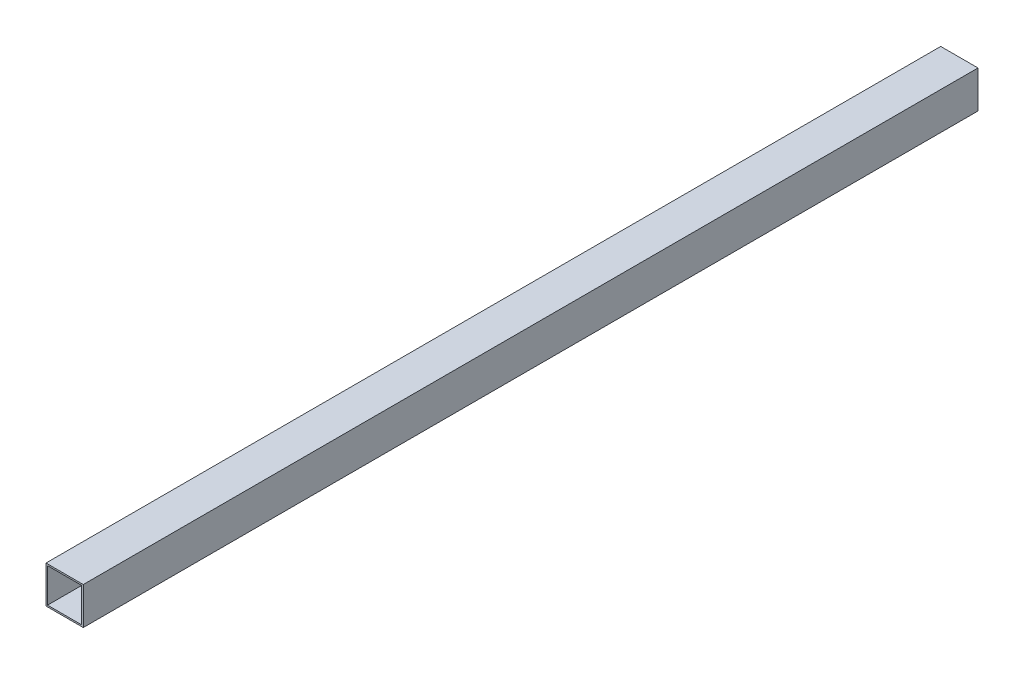
ISO-10303-21;
HEADER;
FILE_DESCRIPTION(('STEP AP214'),'2;1');
FILE_NAME('part.step','',(''),(''),'','','');
FILE_SCHEMA(('AUTOMOTIVE_DESIGN { 1 0 10303 214 1 1 1 1 }'));
ENDSEC;
DATA;
#1=APPLICATION_CONTEXT('core data for automotive mechanical design processes');
#2=APPLICATION_PROTOCOL_DEFINITION('international standard','automotive_design',2000,#1);
#3=PRODUCT_CONTEXT('',#1,'mechanical');
#4=PRODUCT('Part','Part','',(#3));
#5=PRODUCT_RELATED_PRODUCT_CATEGORY('part','',(#4));
#6=PRODUCT_DEFINITION_FORMATION('','',#4);
#7=PRODUCT_DEFINITION_CONTEXT('part definition',#1,'design');
#8=PRODUCT_DEFINITION('design','',#6,#7);
#9=PRODUCT_DEFINITION_SHAPE('','',#8);
#10=(LENGTH_UNIT() NAMED_UNIT(*) SI_UNIT(.MILLI.,.METRE.));
#11=(NAMED_UNIT(*) PLANE_ANGLE_UNIT() SI_UNIT($,.RADIAN.));
#12=(NAMED_UNIT(*) SI_UNIT($,.STERADIAN.) SOLID_ANGLE_UNIT());
#13=UNCERTAINTY_MEASURE_WITH_UNIT(LENGTH_MEASURE(1.E-05),#10,'distance_accuracy_value','');
#14=(GEOMETRIC_REPRESENTATION_CONTEXT(3) GLOBAL_UNCERTAINTY_ASSIGNED_CONTEXT((#13)) GLOBAL_UNIT_ASSIGNED_CONTEXT((#10,
#11,#12)) REPRESENTATION_CONTEXT('',''));
#15=CARTESIAN_POINT('',(0.,0.,0.));
#16=DIRECTION('',(0.,0.,1.));
#17=DIRECTION('',(1.,0.,0.));
#18=AXIS2_PLACEMENT_3D('',#15,#16,#17);
#19=CARTESIAN_POINT('',(0.,0.,914.4));
#20=DIRECTION('',(0.,0.,-1.));
#21=DIRECTION('',(-1.,0.,0.));
#22=AXIS2_PLACEMENT_3D('',#19,#20,#21);
#23=PLANE('',#22);
#24=DIRECTION('',(0.,-1.,0.));
#25=VECTOR('',#24,1.);
#26=CARTESIAN_POINT('',(0.,0.,914.4));
#27=LINE('',#26,#25);
#28=CARTESIAN_POINT('',(0.,38.1,914.4));
#29=VERTEX_POINT('',#28);
#30=CARTESIAN_POINT('',(0.,0.,914.4));
#31=VERTEX_POINT('',#30);
#32=EDGE_CURVE('E134',#29,#31,#27,.T.);
#33=ORIENTED_EDGE('',*,*,#32,.T.);
#34=DIRECTION('',(1.,0.,0.));
#35=VECTOR('',#34,1.);
#36=CARTESIAN_POINT('',(0.,0.,914.4));
#37=LINE('',#36,#35);
#38=CARTESIAN_POINT('',(38.1,0.,914.4));
#39=VERTEX_POINT('',#38);
#40=EDGE_CURVE('E137',#31,#39,#37,.T.);
#41=ORIENTED_EDGE('',*,*,#40,.T.);
#42=DIRECTION('',(0.,1.,0.));
#43=VECTOR('',#42,1.);
#44=CARTESIAN_POINT('',(38.1,0.,914.4));
#45=LINE('',#44,#43);
#46=CARTESIAN_POINT('',(38.1,38.1,914.4));
#47=VERTEX_POINT('',#46);
#48=EDGE_CURVE('E140',#39,#47,#45,.T.);
#49=ORIENTED_EDGE('',*,*,#48,.T.);
#50=DIRECTION('',(-1.,0.,0.));
#51=VECTOR('',#50,1.);
#52=CARTESIAN_POINT('',(0.,38.1,914.4));
#53=LINE('',#52,#51);
#54=EDGE_CURVE('E142',#47,#29,#53,.T.);
#55=ORIENTED_EDGE('',*,*,#54,.T.);
#56=EDGE_LOOP('',(#33,#41,#49,#55));
#57=FACE_BOUND('',#56,.T.);
#58=DIRECTION('',(0.,-1.,0.));
#59=VECTOR('',#58,1.);
#60=CARTESIAN_POINT('',(1.5875,1.5875,914.4));
#61=LINE('',#60,#59);
#62=CARTESIAN_POINT('',(1.5875,36.5125,914.4));
#63=VERTEX_POINT('',#62);
#64=CARTESIAN_POINT('',(1.5875,1.5875,914.4));
#65=VERTEX_POINT('',#64);
#66=EDGE_CURVE('E98',#63,#65,#61,.T.);
#67=ORIENTED_EDGE('',*,*,#66,.F.);
#68=DIRECTION('',(-1.,0.,0.));
#69=VECTOR('',#68,1.);
#70=CARTESIAN_POINT('',(1.5875,36.5125,914.4));
#71=LINE('',#70,#69);
#72=CARTESIAN_POINT('',(36.5125,36.5125,914.4));
#73=VERTEX_POINT('',#72);
#74=EDGE_CURVE('E120',#73,#63,#71,.T.);
#75=ORIENTED_EDGE('',*,*,#74,.F.);
#76=DIRECTION('',(0.,1.,0.));
#77=VECTOR('',#76,1.);
#78=CARTESIAN_POINT('',(36.5125,1.5875,914.4));
#79=LINE('',#78,#77);
#80=CARTESIAN_POINT('',(36.5125,1.5875,914.4));
#81=VERTEX_POINT('',#80);
#82=EDGE_CURVE('E118',#81,#73,#79,.T.);
#83=ORIENTED_EDGE('',*,*,#82,.F.);
#84=DIRECTION('',(1.,0.,0.));
#85=VECTOR('',#84,1.);
#86=CARTESIAN_POINT('',(1.5875,1.5875,914.4));
#87=LINE('',#86,#85);
#88=EDGE_CURVE('E106',#65,#81,#87,.T.);
#89=ORIENTED_EDGE('',*,*,#88,.F.);
#90=EDGE_LOOP('',(#67,#75,#83,#89));
#91=FACE_BOUND('',#90,.T.);
#92=ADVANCED_FACE('F33',(#57,#91),#23,.F.);
#93=CARTESIAN_POINT('',(0.,0.,0.));
#94=DIRECTION('',(0.,0.,-1.));
#95=DIRECTION('',(-1.,0.,0.));
#96=AXIS2_PLACEMENT_3D('',#93,#94,#95);
#97=PLANE('',#96);
#98=DIRECTION('',(0.,-1.,0.));
#99=VECTOR('',#98,1.);
#100=CARTESIAN_POINT('',(0.,0.,0.));
#101=LINE('',#100,#99);
#102=CARTESIAN_POINT('',(0.,38.1,0.));
#103=VERTEX_POINT('',#102);
#104=CARTESIAN_POINT('',(0.,0.,0.));
#105=VERTEX_POINT('',#104);
#106=EDGE_CURVE('E114',#103,#105,#101,.T.);
#107=ORIENTED_EDGE('',*,*,#106,.F.);
#108=DIRECTION('',(-1.,0.,0.));
#109=VECTOR('',#108,1.);
#110=CARTESIAN_POINT('',(0.,38.1,0.));
#111=LINE('',#110,#109);
#112=CARTESIAN_POINT('',(38.1,38.1,0.));
#113=VERTEX_POINT('',#112);
#114=EDGE_CURVE('E138',#113,#103,#111,.T.);
#115=ORIENTED_EDGE('',*,*,#114,.F.);
#116=DIRECTION('',(0.,1.,0.));
#117=VECTOR('',#116,1.);
#118=CARTESIAN_POINT('',(38.1,0.,0.));
#119=LINE('',#118,#117);
#120=CARTESIAN_POINT('',(38.1,0.,0.));
#121=VERTEX_POINT('',#120);
#122=EDGE_CURVE('E149',#121,#113,#119,.T.);
#123=ORIENTED_EDGE('',*,*,#122,.F.);
#124=DIRECTION('',(1.,0.,0.));
#125=VECTOR('',#124,1.);
#126=CARTESIAN_POINT('',(0.,0.,0.));
#127=LINE('',#126,#125);
#128=EDGE_CURVE('E147',#105,#121,#127,.T.);
#129=ORIENTED_EDGE('',*,*,#128,.F.);
#130=EDGE_LOOP('',(#107,#115,#123,#129));
#131=FACE_BOUND('',#130,.T.);
#132=DIRECTION('',(-1.,0.,0.));
#133=VECTOR('',#132,1.);
#134=CARTESIAN_POINT('',(1.5875,36.5125,0.));
#135=LINE('',#134,#133);
#136=CARTESIAN_POINT('',(36.5125,36.5125,0.));
#137=VERTEX_POINT('',#136);
#138=CARTESIAN_POINT('',(1.5875,36.5125,0.));
#139=VERTEX_POINT('',#138);
#140=EDGE_CURVE('E107',#137,#139,#135,.T.);
#141=ORIENTED_EDGE('',*,*,#140,.T.);
#142=DIRECTION('',(0.,-1.,0.));
#143=VECTOR('',#142,1.);
#144=CARTESIAN_POINT('',(1.5875,1.5875,0.));
#145=LINE('',#144,#143);
#146=CARTESIAN_POINT('',(1.5875,1.5875,0.));
#147=VERTEX_POINT('',#146);
#148=EDGE_CURVE('E56',#139,#147,#145,.T.);
#149=ORIENTED_EDGE('',*,*,#148,.T.);
#150=DIRECTION('',(1.,0.,0.));
#151=VECTOR('',#150,1.);
#152=CARTESIAN_POINT('',(1.5875,1.5875,0.));
#153=LINE('',#152,#151);
#154=CARTESIAN_POINT('',(36.5125,1.5875,0.));
#155=VERTEX_POINT('',#154);
#156=EDGE_CURVE('E113',#147,#155,#153,.T.);
#157=ORIENTED_EDGE('',*,*,#156,.T.);
#158=DIRECTION('',(0.,1.,0.));
#159=VECTOR('',#158,1.);
#160=CARTESIAN_POINT('',(36.5125,1.5875,0.));
#161=LINE('',#160,#159);
#162=EDGE_CURVE('E126',#155,#137,#161,.T.);
#163=ORIENTED_EDGE('',*,*,#162,.T.);
#164=EDGE_LOOP('',(#141,#149,#157,#163));
#165=FACE_BOUND('',#164,.T.);
#166=ADVANCED_FACE('F167',(#131,#165),#97,.T.);
#167=CARTESIAN_POINT('',(0.,0.,914.4));
#168=DIRECTION('',(1.,0.,0.));
#169=DIRECTION('',(0.,0.,-1.));
#170=AXIS2_PLACEMENT_3D('',#167,#168,#169);
#171=PLANE('',#170);
#172=ORIENTED_EDGE('',*,*,#106,.T.);
#173=DIRECTION('',(0.,0.,-1.));
#174=VECTOR('',#173,1.);
#175=CARTESIAN_POINT('',(0.,0.,914.4));
#176=LINE('',#175,#174);
#177=EDGE_CURVE('E11',#31,#105,#176,.T.);
#178=ORIENTED_EDGE('',*,*,#177,.F.);
#179=ORIENTED_EDGE('',*,*,#32,.F.);
#180=DIRECTION('',(0.,0.,-1.));
#181=VECTOR('',#180,1.);
#182=CARTESIAN_POINT('',(0.,38.1,914.4));
#183=LINE('',#182,#181);
#184=EDGE_CURVE('E144',#29,#103,#183,.T.);
#185=ORIENTED_EDGE('',*,*,#184,.T.);
#186=EDGE_LOOP('',(#172,#178,#179,#185));
#187=FACE_BOUND('',#186,.T.);
#188=ADVANCED_FACE('F35',(#187),#171,.F.);
#189=CARTESIAN_POINT('',(0.,0.,914.4));
#190=DIRECTION('',(0.,1.,0.));
#191=DIRECTION('',(0.,0.,1.));
#192=AXIS2_PLACEMENT_3D('',#189,#190,#191);
#193=PLANE('',#192);
#194=ORIENTED_EDGE('',*,*,#128,.T.);
#195=DIRECTION('',(0.,0.,-1.));
#196=VECTOR('',#195,1.);
#197=CARTESIAN_POINT('',(38.1,0.,914.4));
#198=LINE('',#197,#196);
#199=EDGE_CURVE('E41',#39,#121,#198,.T.);
#200=ORIENTED_EDGE('',*,*,#199,.F.);
#201=ORIENTED_EDGE('',*,*,#40,.F.);
#202=ORIENTED_EDGE('',*,*,#177,.T.);
#203=EDGE_LOOP('',(#194,#200,#201,#202));
#204=FACE_BOUND('',#203,.T.);
#205=ADVANCED_FACE('F177',(#204),#193,.F.);
#206=CARTESIAN_POINT('',(38.1,0.,914.4));
#207=DIRECTION('',(-1.,0.,0.));
#208=DIRECTION('',(0.,0.,1.));
#209=AXIS2_PLACEMENT_3D('',#206,#207,#208);
#210=PLANE('',#209);
#211=ORIENTED_EDGE('',*,*,#122,.T.);
#212=DIRECTION('',(0.,0.,-1.));
#213=VECTOR('',#212,1.);
#214=CARTESIAN_POINT('',(38.1,38.1,914.4));
#215=LINE('',#214,#213);
#216=EDGE_CURVE('E154',#47,#113,#215,.T.);
#217=ORIENTED_EDGE('',*,*,#216,.F.);
#218=ORIENTED_EDGE('',*,*,#48,.F.);
#219=ORIENTED_EDGE('',*,*,#199,.T.);
#220=EDGE_LOOP('',(#211,#217,#218,#219));
#221=FACE_BOUND('',#220,.T.);
#222=ADVANCED_FACE('F161',(#221),#210,.F.);
#223=CARTESIAN_POINT('',(0.,38.1,914.4));
#224=DIRECTION('',(0.,-1.,0.));
#225=DIRECTION('',(0.,0.,-1.));
#226=AXIS2_PLACEMENT_3D('',#223,#224,#225);
#227=PLANE('',#226);
#228=ORIENTED_EDGE('',*,*,#114,.T.);
#229=ORIENTED_EDGE('',*,*,#184,.F.);
#230=ORIENTED_EDGE('',*,*,#54,.F.);
#231=ORIENTED_EDGE('',*,*,#216,.T.);
#232=EDGE_LOOP('',(#228,#229,#230,#231));
#233=FACE_BOUND('',#232,.T.);
#234=ADVANCED_FACE('F171',(#233),#227,.F.);
#235=CARTESIAN_POINT('',(1.5875,1.5875,914.4));
#236=DIRECTION('',(1.,0.,0.));
#237=DIRECTION('',(0.,1.,0.));
#238=AXIS2_PLACEMENT_3D('',#235,#236,#237);
#239=PLANE('',#238);
#240=ORIENTED_EDGE('',*,*,#148,.F.);
#241=DIRECTION('',(0.,0.,-1.));
#242=VECTOR('',#241,1.);
#243=CARTESIAN_POINT('',(1.5875,36.5125,914.4));
#244=LINE('',#243,#242);
#245=EDGE_CURVE('E102',#63,#139,#244,.T.);
#246=ORIENTED_EDGE('',*,*,#245,.F.);
#247=ORIENTED_EDGE('',*,*,#66,.T.);
#248=DIRECTION('',(0.,0.,-1.));
#249=VECTOR('',#248,1.);
#250=CARTESIAN_POINT('',(1.5875,1.5875,914.4));
#251=LINE('',#250,#249);
#252=EDGE_CURVE('E101',#65,#147,#251,.T.);
#253=ORIENTED_EDGE('',*,*,#252,.T.);
#254=EDGE_LOOP('',(#240,#246,#247,#253));
#255=FACE_BOUND('',#254,.T.);
#256=ADVANCED_FACE('F100',(#255),#239,.T.);
#257=CARTESIAN_POINT('',(1.5875,1.5875,914.4));
#258=DIRECTION('',(0.,1.,0.));
#259=DIRECTION('',(0.,0.,1.));
#260=AXIS2_PLACEMENT_3D('',#257,#258,#259);
#261=PLANE('',#260);
#262=ORIENTED_EDGE('',*,*,#156,.F.);
#263=ORIENTED_EDGE('',*,*,#252,.F.);
#264=ORIENTED_EDGE('',*,*,#88,.T.);
#265=DIRECTION('',(0.,0.,-1.));
#266=VECTOR('',#265,1.);
#267=CARTESIAN_POINT('',(36.5125,1.5875,914.4));
#268=LINE('',#267,#266);
#269=EDGE_CURVE('E115',#81,#155,#268,.T.);
#270=ORIENTED_EDGE('',*,*,#269,.T.);
#271=EDGE_LOOP('',(#262,#263,#264,#270));
#272=FACE_BOUND('',#271,.T.);
#273=ADVANCED_FACE('F110',(#272),#261,.T.);
#274=CARTESIAN_POINT('',(36.5125,1.5875,914.4));
#275=DIRECTION('',(-1.,0.,0.));
#276=DIRECTION('',(0.,0.,1.));
#277=AXIS2_PLACEMENT_3D('',#274,#275,#276);
#278=PLANE('',#277);
#279=ORIENTED_EDGE('',*,*,#162,.F.);
#280=ORIENTED_EDGE('',*,*,#269,.F.);
#281=ORIENTED_EDGE('',*,*,#82,.T.);
#282=DIRECTION('',(0.,0.,-1.));
#283=VECTOR('',#282,1.);
#284=CARTESIAN_POINT('',(36.5125,36.5125,914.4));
#285=LINE('',#284,#283);
#286=EDGE_CURVE('E48',#73,#137,#285,.T.);
#287=ORIENTED_EDGE('',*,*,#286,.T.);
#288=EDGE_LOOP('',(#279,#280,#281,#287));
#289=FACE_BOUND('',#288,.T.);
#290=ADVANCED_FACE('F200',(#289),#278,.T.);
#291=CARTESIAN_POINT('',(1.5875,36.5125,914.4));
#292=DIRECTION('',(0.,-1.,0.));
#293=DIRECTION('',(0.,0.,-1.));
#294=AXIS2_PLACEMENT_3D('',#291,#292,#293);
#295=PLANE('',#294);
#296=ORIENTED_EDGE('',*,*,#140,.F.);
#297=ORIENTED_EDGE('',*,*,#286,.F.);
#298=ORIENTED_EDGE('',*,*,#74,.T.);
#299=ORIENTED_EDGE('',*,*,#245,.T.);
#300=EDGE_LOOP('',(#296,#297,#298,#299));
#301=FACE_BOUND('',#300,.T.);
#302=ADVANCED_FACE('F204',(#301),#295,.T.);
#303=CLOSED_SHELL('',(#92,#166,#188,#205,#222,#234,#256,#273,#290,#302));
#304=MANIFOLD_SOLID_BREP('B2',#303);
#305=ADVANCED_BREP_SHAPE_REPRESENTATION('',(#18,#304),#14);
#306=SHAPE_DEFINITION_REPRESENTATION(#9,#305);
ENDSEC;
END-ISO-10303-21;
